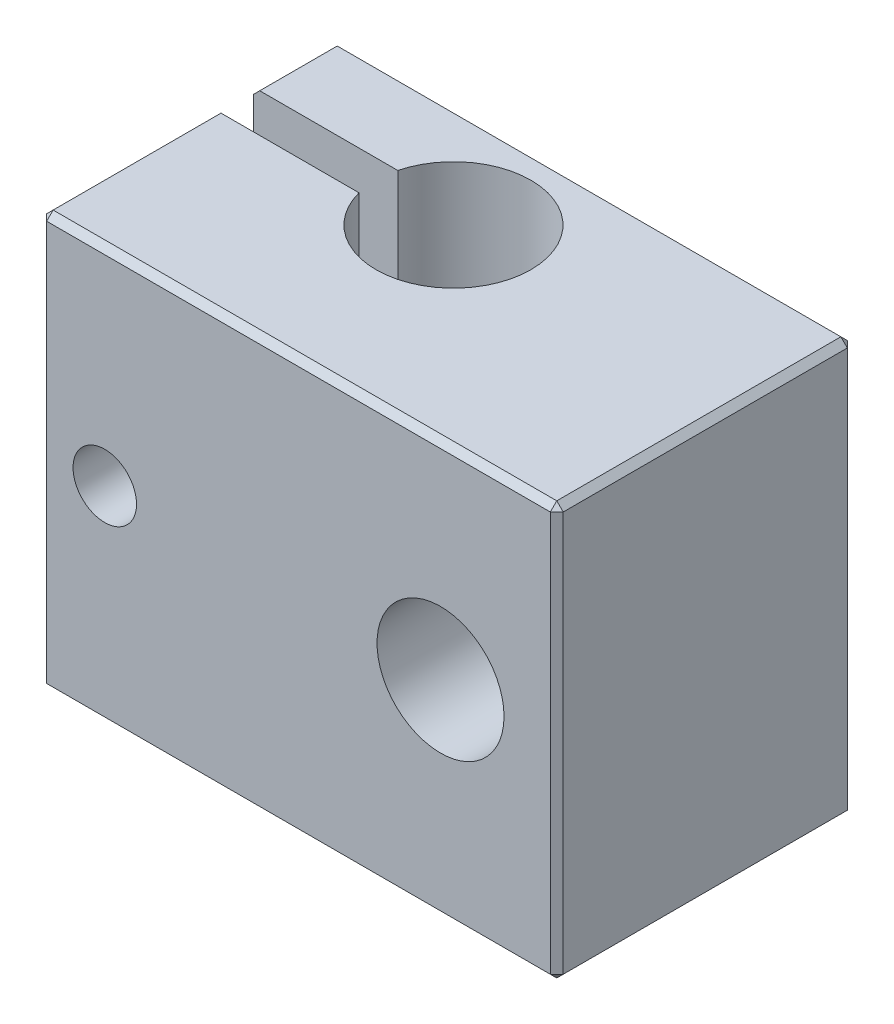
ISO-10303-21;
HEADER;
FILE_DESCRIPTION(('STEP AP214'),'2;1');
FILE_NAME('part.step','',(''),(''),'','','');
FILE_SCHEMA(('AUTOMOTIVE_DESIGN { 1 0 10303 214 1 1 1 1 }'));
ENDSEC;
DATA;
#1=APPLICATION_CONTEXT('core data for automotive mechanical design processes');
#2=APPLICATION_PROTOCOL_DEFINITION('international standard','automotive_design',2000,#1);
#3=PRODUCT_CONTEXT('',#1,'mechanical');
#4=PRODUCT('Part','Part','',(#3));
#5=PRODUCT_RELATED_PRODUCT_CATEGORY('part','',(#4));
#6=PRODUCT_DEFINITION_FORMATION('','',#4);
#7=PRODUCT_DEFINITION_CONTEXT('part definition',#1,'design');
#8=PRODUCT_DEFINITION('design','',#6,#7);
#9=PRODUCT_DEFINITION_SHAPE('','',#8);
#10=(LENGTH_UNIT() NAMED_UNIT(*) SI_UNIT(.MILLI.,.METRE.));
#11=(NAMED_UNIT(*) PLANE_ANGLE_UNIT() SI_UNIT($,.RADIAN.));
#12=(NAMED_UNIT(*) SI_UNIT($,.STERADIAN.) SOLID_ANGLE_UNIT());
#13=UNCERTAINTY_MEASURE_WITH_UNIT(LENGTH_MEASURE(1.E-05),#10,'distance_accuracy_value','');
#14=(GEOMETRIC_REPRESENTATION_CONTEXT(3) GLOBAL_UNCERTAINTY_ASSIGNED_CONTEXT((#13)) GLOBAL_UNIT_ASSIGNED_CONTEXT((#10,
#11,#12)) REPRESENTATION_CONTEXT('',''));
#15=CARTESIAN_POINT('',(0.,0.,0.));
#16=DIRECTION('',(0.,0.,1.));
#17=DIRECTION('',(1.,0.,0.));
#18=AXIS2_PLACEMENT_3D('',#15,#16,#17);
#19=CARTESIAN_POINT('',(0.25,0.,0.25));
#20=DIRECTION('',(-0.577350269189626,-0.577350269189626,-0.577350269189625));
#21=DIRECTION('',(-0.816496580927726,0.408248290463863,0.408248290463863));
#22=AXIS2_PLACEMENT_3D('',#19,#20,#21);
#23=PLANE('',#22);
#24=DIRECTION('',(-0.707106781186547,0.,0.707106781186548));
#25=VECTOR('',#24,1.);
#26=CARTESIAN_POINT('',(0.25,0.25,0.));
#27=LINE('',#26,#25);
#28=CARTESIAN_POINT('',(0.25,0.25,0.));
#29=VERTEX_POINT('',#28);
#30=CARTESIAN_POINT('',(0.,0.25,0.25));
#31=VERTEX_POINT('',#30);
#32=EDGE_CURVE('E36',#29,#31,#27,.T.);
#33=ORIENTED_EDGE('',*,*,#32,.F.);
#34=DIRECTION('',(0.,0.707106781186548,-0.707106781186547));
#35=VECTOR('',#34,1.);
#36=CARTESIAN_POINT('',(0.25,0.,0.25));
#37=LINE('',#36,#35);
#38=CARTESIAN_POINT('',(0.25,0.,0.25));
#39=VERTEX_POINT('',#38);
#40=EDGE_CURVE('E378',#39,#29,#37,.T.);
#41=ORIENTED_EDGE('',*,*,#40,.F.);
#42=DIRECTION('',(0.707106781186548,-0.707106781186548,0.));
#43=VECTOR('',#42,1.);
#44=CARTESIAN_POINT('',(0.,0.25,0.25));
#45=LINE('',#44,#43);
#46=EDGE_CURVE('E249',#31,#39,#45,.T.);
#47=ORIENTED_EDGE('',*,*,#46,.F.);
#48=EDGE_LOOP('',(#33,#41,#47));
#49=FACE_BOUND('',#48,.T.);
#50=ADVANCED_FACE('F17',(#49),#23,.T.);
#51=CARTESIAN_POINT('',(0.249999999999993,15.75,0.));
#52=DIRECTION('',(-0.577350269189624,0.57735026918963,-0.577350269189623));
#53=DIRECTION('',(0.,0.707106781186548,0.707106781186548));
#54=AXIS2_PLACEMENT_3D('',#51,#52,#53);
#55=PLANE('',#54);
#56=DIRECTION('',(-0.707106781186548,-0.707106781186547,0.));
#57=VECTOR('',#56,1.);
#58=CARTESIAN_POINT('',(0.249999999999995,16.,0.25));
#59=LINE('',#58,#57);
#60=CARTESIAN_POINT('',(0.249999999999995,16.,0.25));
#61=VERTEX_POINT('',#60);
#62=CARTESIAN_POINT('',(0.,15.75,0.25));
#63=VERTEX_POINT('',#62);
#64=EDGE_CURVE('E258',#61,#63,#59,.T.);
#65=ORIENTED_EDGE('',*,*,#64,.F.);
#66=DIRECTION('',(0.,0.707106781186546,0.707106781186549));
#67=VECTOR('',#66,1.);
#68=CARTESIAN_POINT('',(0.249999999999993,15.75,0.));
#69=LINE('',#68,#67);
#70=CARTESIAN_POINT('',(0.249999999999995,15.75,0.));
#71=VERTEX_POINT('',#70);
#72=EDGE_CURVE('E362',#71,#61,#69,.T.);
#73=ORIENTED_EDGE('',*,*,#72,.F.);
#74=DIRECTION('',(0.707106781186547,0.,-0.707106781186548));
#75=VECTOR('',#74,1.);
#76=CARTESIAN_POINT('',(0.,15.75,0.25));
#77=LINE('',#76,#75);
#78=EDGE_CURVE('E268',#63,#71,#77,.T.);
#79=ORIENTED_EDGE('',*,*,#78,.F.);
#80=EDGE_LOOP('',(#65,#73,#79));
#81=FACE_BOUND('',#80,.T.);
#82=ADVANCED_FACE('F421',(#81),#55,.T.);
#83=CARTESIAN_POINT('',(19.75,0.25,0.));
#84=DIRECTION('',(0.577350269189627,-0.577350269189625,-0.577350269189625));
#85=DIRECTION('',(0.816496580927725,0.408248290463864,0.408248290463864));
#86=AXIS2_PLACEMENT_3D('',#83,#84,#85);
#87=PLANE('',#86);
#88=DIRECTION('',(0.707106781186546,0.707106781186549,0.));
#89=VECTOR('',#88,1.);
#90=CARTESIAN_POINT('',(19.75,0.,0.25));
#91=LINE('',#90,#89);
#92=CARTESIAN_POINT('',(19.75,0.,0.25));
#93=VERTEX_POINT('',#92);
#94=CARTESIAN_POINT('',(20.,0.25,0.25));
#95=VERTEX_POINT('',#94);
#96=EDGE_CURVE('E345',#93,#95,#91,.T.);
#97=ORIENTED_EDGE('',*,*,#96,.F.);
#98=DIRECTION('',(0.,-0.707106781186548,0.707106781186547));
#99=VECTOR('',#98,1.);
#100=CARTESIAN_POINT('',(19.75,0.25,0.));
#101=LINE('',#100,#99);
#102=CARTESIAN_POINT('',(19.75,0.25,0.));
#103=VERTEX_POINT('',#102);
#104=EDGE_CURVE('E11',#103,#93,#101,.T.);
#105=ORIENTED_EDGE('',*,*,#104,.F.);
#106=DIRECTION('',(-0.707106781186546,0.,-0.707106781186549));
#107=VECTOR('',#106,1.);
#108=CARTESIAN_POINT('',(20.,0.25,0.25));
#109=LINE('',#108,#107);
#110=EDGE_CURVE('E366',#95,#103,#109,.T.);
#111=ORIENTED_EDGE('',*,*,#110,.F.);
#112=EDGE_LOOP('',(#97,#105,#111));
#113=FACE_BOUND('',#112,.T.);
#114=ADVANCED_FACE('F436',(#113),#87,.T.);
#115=CARTESIAN_POINT('',(5.,0.125,0.125));
#116=DIRECTION('',(0.,-0.707106781186547,-0.707106781186548));
#117=DIRECTION('',(0.577350269189626,-0.577350269189626,0.577350269189626));
#118=AXIS2_PLACEMENT_3D('',#115,#116,#117);
#119=PLANE('',#118);
#120=ORIENTED_EDGE('',*,*,#104,.T.);
#121=DIRECTION('',(-1.,0.,0.));
#122=VECTOR('',#121,1.);
#123=CARTESIAN_POINT('',(5.,0.,0.25));
#124=LINE('',#123,#122);
#125=EDGE_CURVE('E27',#93,#39,#124,.T.);
#126=ORIENTED_EDGE('',*,*,#125,.T.);
#127=ORIENTED_EDGE('',*,*,#40,.T.);
#128=DIRECTION('',(1.,0.,0.));
#129=VECTOR('',#128,1.);
#130=CARTESIAN_POINT('',(5.,0.25,0.));
#131=LINE('',#130,#129);
#132=EDGE_CURVE('E374',#29,#103,#131,.T.);
#133=ORIENTED_EDGE('',*,*,#132,.T.);
#134=EDGE_LOOP('',(#120,#126,#127,#133));
#135=FACE_BOUND('',#134,.T.);
#136=ADVANCED_FACE('F427',(#135),#119,.T.);
#137=CARTESIAN_POINT('',(19.75,15.75,0.));
#138=DIRECTION('',(0.577350269189627,0.577350269189627,-0.577350269189624));
#139=DIRECTION('',(0.,0.707106781186548,0.707106781186548));
#140=AXIS2_PLACEMENT_3D('',#137,#138,#139);
#141=PLANE('',#140);
#142=DIRECTION('',(-0.707106781186548,0.707106781186548,0.));
#143=VECTOR('',#142,1.);
#144=CARTESIAN_POINT('',(20.,15.75,0.25));
#145=LINE('',#144,#143);
#146=CARTESIAN_POINT('',(20.,15.75,0.25));
#147=VERTEX_POINT('',#146);
#148=CARTESIAN_POINT('',(19.75,16.,0.25));
#149=VERTEX_POINT('',#148);
#150=EDGE_CURVE('E333',#147,#149,#145,.T.);
#151=ORIENTED_EDGE('',*,*,#150,.F.);
#152=DIRECTION('',(0.707106781186546,0.,0.707106781186549));
#153=VECTOR('',#152,1.);
#154=CARTESIAN_POINT('',(19.75,15.75,0.));
#155=LINE('',#154,#153);
#156=CARTESIAN_POINT('',(19.75,15.75,0.));
#157=VERTEX_POINT('',#156);
#158=EDGE_CURVE('E370',#157,#147,#155,.T.);
#159=ORIENTED_EDGE('',*,*,#158,.F.);
#160=DIRECTION('',(0.,-0.707106781186546,-0.707106781186549));
#161=VECTOR('',#160,1.);
#162=CARTESIAN_POINT('',(19.75,16.,0.25));
#163=LINE('',#162,#161);
#164=EDGE_CURVE('E358',#149,#157,#163,.T.);
#165=ORIENTED_EDGE('',*,*,#164,.F.);
#166=EDGE_LOOP('',(#151,#159,#165));
#167=FACE_BOUND('',#166,.T.);
#168=ADVANCED_FACE('F444',(#167),#141,.T.);
#169=CARTESIAN_POINT('',(19.875,4.,0.125));
#170=DIRECTION('',(0.707106781186549,0.,-0.707106781186546));
#171=DIRECTION('',(0.577350269189624,0.577350269189627,0.577350269189627));
#172=AXIS2_PLACEMENT_3D('',#169,#170,#171);
#173=PLANE('',#172);
#174=ORIENTED_EDGE('',*,*,#158,.T.);
#175=DIRECTION('',(0.,-1.,0.));
#176=VECTOR('',#175,1.);
#177=CARTESIAN_POINT('',(20.,4.,0.25));
#178=LINE('',#177,#176);
#179=EDGE_CURVE('E367',#147,#95,#178,.T.);
#180=ORIENTED_EDGE('',*,*,#179,.T.);
#181=ORIENTED_EDGE('',*,*,#110,.T.);
#182=DIRECTION('',(0.,1.,0.));
#183=VECTOR('',#182,1.);
#184=CARTESIAN_POINT('',(19.75,4.,0.));
#185=LINE('',#184,#183);
#186=EDGE_CURVE('E363',#103,#157,#185,.T.);
#187=ORIENTED_EDGE('',*,*,#186,.T.);
#188=EDGE_LOOP('',(#174,#180,#181,#187));
#189=FACE_BOUND('',#188,.T.);
#190=ADVANCED_FACE('F447',(#189),#173,.T.);
#191=CARTESIAN_POINT('',(15.,15.875,0.125));
#192=DIRECTION('',(0.,0.707106781186549,-0.707106781186546));
#193=DIRECTION('',(0.577350269189627,0.577350269189624,0.577350269189627));
#194=AXIS2_PLACEMENT_3D('',#191,#192,#193);
#195=PLANE('',#194);
#196=ORIENTED_EDGE('',*,*,#72,.T.);
#197=DIRECTION('',(1.,0.,0.));
#198=VECTOR('',#197,1.);
#199=CARTESIAN_POINT('',(15.,16.,0.25));
#200=LINE('',#199,#198);
#201=EDGE_CURVE('E359',#61,#149,#200,.T.);
#202=ORIENTED_EDGE('',*,*,#201,.T.);
#203=ORIENTED_EDGE('',*,*,#164,.T.);
#204=DIRECTION('',(-1.,0.,0.));
#205=VECTOR('',#204,1.);
#206=CARTESIAN_POINT('',(15.,15.75,0.));
#207=LINE('',#206,#205);
#208=EDGE_CURVE('E353',#157,#71,#207,.T.);
#209=ORIENTED_EDGE('',*,*,#208,.T.);
#210=EDGE_LOOP('',(#196,#202,#203,#209));
#211=FACE_BOUND('',#210,.T.);
#212=ADVANCED_FACE('F418',(#211),#195,.T.);
#213=CARTESIAN_POINT('',(20.,0.25,11.25));
#214=DIRECTION('',(0.577350269189627,-0.577350269189624,0.577350269189627));
#215=DIRECTION('',(0.,0.707106781186548,0.707106781186548));
#216=AXIS2_PLACEMENT_3D('',#213,#214,#215);
#217=PLANE('',#216);
#218=DIRECTION('',(0.,0.707106781186549,0.707106781186546));
#219=VECTOR('',#218,1.);
#220=CARTESIAN_POINT('',(19.75,0.,11.25));
#221=LINE('',#220,#219);
#222=CARTESIAN_POINT('',(19.75,0.,11.25));
#223=VERTEX_POINT('',#222);
#224=CARTESIAN_POINT('',(19.75,0.25,11.5));
#225=VERTEX_POINT('',#224);
#226=EDGE_CURVE('E316',#223,#225,#221,.T.);
#227=ORIENTED_EDGE('',*,*,#226,.F.);
#228=DIRECTION('',(-0.707106781186546,-0.707106781186549,0.));
#229=VECTOR('',#228,1.);
#230=CARTESIAN_POINT('',(20.,0.25,11.25));
#231=LINE('',#230,#229);
#232=CARTESIAN_POINT('',(20.,0.25,11.25));
#233=VERTEX_POINT('',#232);
#234=EDGE_CURVE('E349',#233,#223,#231,.T.);
#235=ORIENTED_EDGE('',*,*,#234,.F.);
#236=DIRECTION('',(0.707106781186548,0.,-0.707106781186548));
#237=VECTOR('',#236,1.);
#238=CARTESIAN_POINT('',(19.75,0.25,11.5));
#239=LINE('',#238,#237);
#240=EDGE_CURVE('E275',#225,#233,#239,.T.);
#241=ORIENTED_EDGE('',*,*,#240,.F.);
#242=EDGE_LOOP('',(#227,#235,#241));
#243=FACE_BOUND('',#242,.T.);
#244=ADVANCED_FACE('F454',(#243),#217,.T.);
#245=CARTESIAN_POINT('',(19.875,0.125,0.));
#246=DIRECTION('',(0.707106781186549,-0.707106781186546,0.));
#247=DIRECTION('',(0.577350269189624,0.577350269189627,0.577350269189627));
#248=AXIS2_PLACEMENT_3D('',#245,#246,#247);
#249=PLANE('',#248);
#250=ORIENTED_EDGE('',*,*,#234,.T.);
#251=DIRECTION('',(0.,0.,-1.));
#252=VECTOR('',#251,1.);
#253=CARTESIAN_POINT('',(19.75,0.,0.));
#254=LINE('',#253,#252);
#255=EDGE_CURVE('E346',#223,#93,#254,.T.);
#256=ORIENTED_EDGE('',*,*,#255,.T.);
#257=ORIENTED_EDGE('',*,*,#96,.T.);
#258=DIRECTION('',(0.,0.,1.));
#259=VECTOR('',#258,1.);
#260=CARTESIAN_POINT('',(20.,0.25,0.));
#261=LINE('',#260,#259);
#262=EDGE_CURVE('E341',#95,#233,#261,.T.);
#263=ORIENTED_EDGE('',*,*,#262,.T.);
#264=EDGE_LOOP('',(#250,#256,#257,#263));
#265=FACE_BOUND('',#264,.T.);
#266=ADVANCED_FACE('F457',(#265),#249,.T.);
#267=CARTESIAN_POINT('',(19.75,16.,11.25));
#268=DIRECTION('',(0.577350269189626,0.577350269189626,0.577350269189626));
#269=DIRECTION('',(-0.816496580927726,0.408248290463863,0.408248290463863));
#270=AXIS2_PLACEMENT_3D('',#267,#268,#269);
#271=PLANE('',#270);
#272=DIRECTION('',(-0.707106781186548,0.,0.707106781186548));
#273=VECTOR('',#272,1.);
#274=CARTESIAN_POINT('',(20.,15.75,11.25));
#275=LINE('',#274,#273);
#276=CARTESIAN_POINT('',(20.,15.75,11.25));
#277=VERTEX_POINT('',#276);
#278=CARTESIAN_POINT('',(19.75,15.75,11.5));
#279=VERTEX_POINT('',#278);
#280=EDGE_CURVE('E279',#277,#279,#275,.T.);
#281=ORIENTED_EDGE('',*,*,#280,.F.);
#282=DIRECTION('',(0.707106781186548,-0.707106781186548,0.));
#283=VECTOR('',#282,1.);
#284=CARTESIAN_POINT('',(19.75,16.,11.25));
#285=LINE('',#284,#283);
#286=CARTESIAN_POINT('',(19.75,16.,11.25));
#287=VERTEX_POINT('',#286);
#288=EDGE_CURVE('E337',#287,#277,#285,.T.);
#289=ORIENTED_EDGE('',*,*,#288,.F.);
#290=DIRECTION('',(0.,0.707106781186548,-0.707106781186548));
#291=VECTOR('',#290,1.);
#292=CARTESIAN_POINT('',(19.75,15.75,11.5));
#293=LINE('',#292,#291);
#294=EDGE_CURVE('E283',#279,#287,#293,.T.);
#295=ORIENTED_EDGE('',*,*,#294,.F.);
#296=EDGE_LOOP('',(#281,#289,#295));
#297=FACE_BOUND('',#296,.T.);
#298=ADVANCED_FACE('F461',(#297),#271,.T.);
#299=CARTESIAN_POINT('',(19.875,15.875,0.));
#300=DIRECTION('',(0.707106781186548,0.707106781186548,0.));
#301=DIRECTION('',(-0.577350269189626,0.577350269189626,0.577350269189626));
#302=AXIS2_PLACEMENT_3D('',#299,#300,#301);
#303=PLANE('',#302);
#304=ORIENTED_EDGE('',*,*,#288,.T.);
#305=DIRECTION('',(0.,0.,-1.));
#306=VECTOR('',#305,1.);
#307=CARTESIAN_POINT('',(20.,15.75,0.));
#308=LINE('',#307,#306);
#309=EDGE_CURVE('E334',#277,#147,#308,.T.);
#310=ORIENTED_EDGE('',*,*,#309,.T.);
#311=ORIENTED_EDGE('',*,*,#150,.T.);
#312=DIRECTION('',(0.,0.,1.));
#313=VECTOR('',#312,1.);
#314=CARTESIAN_POINT('',(19.75,16.,0.));
#315=LINE('',#314,#313);
#316=EDGE_CURVE('E326',#149,#287,#315,.T.);
#317=ORIENTED_EDGE('',*,*,#316,.T.);
#318=EDGE_LOOP('',(#304,#310,#311,#317));
#319=FACE_BOUND('',#318,.T.);
#320=ADVANCED_FACE('F465',(#319),#303,.T.);
#321=CARTESIAN_POINT('',(0.25,0.,11.25));
#322=DIRECTION('',(-0.577350269189625,-0.577350269189625,0.577350269189628));
#323=DIRECTION('',(0.,0.707106781186548,0.707106781186548));
#324=AXIS2_PLACEMENT_3D('',#321,#322,#323);
#325=PLANE('',#324);
#326=DIRECTION('',(0.707106781186549,0.,0.707106781186546));
#327=VECTOR('',#326,1.);
#328=CARTESIAN_POINT('',(0.,0.25,11.25));
#329=LINE('',#328,#327);
#330=CARTESIAN_POINT('',(0.,0.25,11.25));
#331=VERTEX_POINT('',#330);
#332=CARTESIAN_POINT('',(0.25,0.25,11.5));
#333=VERTEX_POINT('',#332);
#334=EDGE_CURVE('E295',#331,#333,#329,.T.);
#335=ORIENTED_EDGE('',*,*,#334,.F.);
#336=DIRECTION('',(-0.707106781186548,0.707106781186548,0.));
#337=VECTOR('',#336,1.);
#338=CARTESIAN_POINT('',(0.25,0.,11.25));
#339=LINE('',#338,#337);
#340=CARTESIAN_POINT('',(0.25,0.,11.25));
#341=VERTEX_POINT('',#340);
#342=EDGE_CURVE('E319',#341,#331,#339,.T.);
#343=ORIENTED_EDGE('',*,*,#342,.F.);
#344=DIRECTION('',(0.,-0.707106781186549,-0.707106781186546));
#345=VECTOR('',#344,1.);
#346=CARTESIAN_POINT('',(0.25,0.25,11.5));
#347=LINE('',#346,#345);
#348=EDGE_CURVE('E312',#333,#341,#347,.T.);
#349=ORIENTED_EDGE('',*,*,#348,.F.);
#350=EDGE_LOOP('',(#335,#343,#349));
#351=FACE_BOUND('',#350,.T.);
#352=ADVANCED_FACE('F469',(#351),#325,.T.);
#353=CARTESIAN_POINT('',(0.125,0.125,0.));
#354=DIRECTION('',(-0.707106781186548,-0.707106781186548,0.));
#355=DIRECTION('',(-0.577350269189626,0.577350269189626,0.577350269189626));
#356=AXIS2_PLACEMENT_3D('',#353,#354,#355);
#357=PLANE('',#356);
#358=DIRECTION('',(0.707106781186548,-0.707106781186548,0.));
#359=VECTOR('',#358,1.);
#360=CARTESIAN_POINT('',(0.124999999999999,0.125000000000001,4.75));
#361=LINE('',#360,#359);
#362=CARTESIAN_POINT('',(0.,0.25,4.75));
#363=VERTEX_POINT('',#362);
#364=CARTESIAN_POINT('',(0.25,0.,4.75));
#365=VERTEX_POINT('',#364);
#366=EDGE_CURVE('E323',#363,#365,#361,.T.);
#367=ORIENTED_EDGE('',*,*,#366,.T.);
#368=DIRECTION('',(0.,0.,1.));
#369=VECTOR('',#368,1.);
#370=CARTESIAN_POINT('',(0.25,0.,0.));
#371=LINE('',#370,#369);
#372=EDGE_CURVE('E320',#365,#341,#371,.T.);
#373=ORIENTED_EDGE('',*,*,#372,.T.);
#374=ORIENTED_EDGE('',*,*,#342,.T.);
#375=DIRECTION('',(0.,0.,-1.));
#376=VECTOR('',#375,1.);
#377=CARTESIAN_POINT('',(0.,0.25,0.));
#378=LINE('',#377,#376);
#379=EDGE_CURVE('E317',#331,#363,#378,.T.);
#380=ORIENTED_EDGE('',*,*,#379,.T.);
#381=EDGE_LOOP('',(#367,#373,#374,#380));
#382=FACE_BOUND('',#381,.T.);
#383=ADVANCED_FACE('F473',(#382),#357,.T.);
#384=CARTESIAN_POINT('',(5.,0.125,11.375));
#385=DIRECTION('',(0.,-0.707106781186546,0.707106781186549));
#386=DIRECTION('',(0.577350269189625,0.577350269189628,0.577350269189625));
#387=AXIS2_PLACEMENT_3D('',#384,#385,#386);
#388=PLANE('',#387);
#389=ORIENTED_EDGE('',*,*,#226,.T.);
#390=DIRECTION('',(-1.,0.,0.));
#391=VECTOR('',#390,1.);
#392=CARTESIAN_POINT('',(5.,0.25,11.5));
#393=LINE('',#392,#391);
#394=EDGE_CURVE('E313',#225,#333,#393,.T.);
#395=ORIENTED_EDGE('',*,*,#394,.T.);
#396=ORIENTED_EDGE('',*,*,#348,.T.);
#397=DIRECTION('',(1.,0.,0.));
#398=VECTOR('',#397,1.);
#399=CARTESIAN_POINT('',(5.,0.,11.25));
#400=LINE('',#399,#398);
#401=EDGE_CURVE('E305',#341,#223,#400,.T.);
#402=ORIENTED_EDGE('',*,*,#401,.T.);
#403=EDGE_LOOP('',(#389,#395,#396,#402));
#404=FACE_BOUND('',#403,.T.);
#405=ADVANCED_FACE('F477',(#404),#388,.T.);
#406=CARTESIAN_POINT('',(0.,15.75,11.25));
#407=DIRECTION('',(-0.577350269189625,0.577350269189626,0.577350269189627));
#408=DIRECTION('',(0.816496580927727,0.408248290463862,0.408248290463862));
#409=AXIS2_PLACEMENT_3D('',#406,#407,#408);
#410=PLANE('',#409);
#411=DIRECTION('',(0.,-0.707106781186548,0.707106781186548));
#412=VECTOR('',#411,1.);
#413=CARTESIAN_POINT('',(0.249999999999995,16.,11.25));
#414=LINE('',#413,#412);
#415=CARTESIAN_POINT('',(0.249999999999995,16.,11.25));
#416=VERTEX_POINT('',#415);
#417=CARTESIAN_POINT('',(0.249999999999995,15.75,11.5));
#418=VERTEX_POINT('',#417);
#419=EDGE_CURVE('E287',#416,#418,#414,.T.);
#420=ORIENTED_EDGE('',*,*,#419,.F.);
#421=DIRECTION('',(0.707106781186548,0.707106781186547,0.));
#422=VECTOR('',#421,1.);
#423=CARTESIAN_POINT('',(0.,15.75,11.25));
#424=LINE('',#423,#422);
#425=CARTESIAN_POINT('',(0.,15.75,11.25));
#426=VERTEX_POINT('',#425);
#427=EDGE_CURVE('E298',#426,#416,#424,.T.);
#428=ORIENTED_EDGE('',*,*,#427,.F.);
#429=DIRECTION('',(-0.707106781186549,0.,-0.707106781186546));
#430=VECTOR('',#429,1.);
#431=CARTESIAN_POINT('',(0.249999999999995,15.75,11.5));
#432=LINE('',#431,#430);
#433=EDGE_CURVE('E291',#418,#426,#432,.T.);
#434=ORIENTED_EDGE('',*,*,#433,.F.);
#435=EDGE_LOOP('',(#420,#428,#434));
#436=FACE_BOUND('',#435,.T.);
#437=ADVANCED_FACE('F481',(#436),#410,.T.);
#438=CARTESIAN_POINT('',(0.124999999999995,15.875,0.));
#439=DIRECTION('',(-0.707106781186547,0.707106781186548,0.));
#440=DIRECTION('',(0.577350269189627,0.577350269189625,0.577350269189625));
#441=AXIS2_PLACEMENT_3D('',#438,#439,#440);
#442=PLANE('',#441);
#443=DIRECTION('',(-0.707106781186548,-0.707106781186547,0.));
#444=VECTOR('',#443,1.);
#445=CARTESIAN_POINT('',(-3.875,11.875,4.75));
#446=LINE('',#445,#444);
#447=CARTESIAN_POINT('',(0.249999999999995,16.,4.75));
#448=VERTEX_POINT('',#447);
#449=CARTESIAN_POINT('',(0.,15.75,4.75));
#450=VERTEX_POINT('',#449);
#451=EDGE_CURVE('E302',#448,#450,#446,.T.);
#452=ORIENTED_EDGE('',*,*,#451,.T.);
#453=DIRECTION('',(0.,0.,1.));
#454=VECTOR('',#453,1.);
#455=CARTESIAN_POINT('',(0.,15.75,0.));
#456=LINE('',#455,#454);
#457=EDGE_CURVE('E299',#450,#426,#456,.T.);
#458=ORIENTED_EDGE('',*,*,#457,.T.);
#459=ORIENTED_EDGE('',*,*,#427,.T.);
#460=DIRECTION('',(0.,0.,-1.));
#461=VECTOR('',#460,1.);
#462=CARTESIAN_POINT('',(0.249999999999995,16.,0.));
#463=LINE('',#462,#461);
#464=EDGE_CURVE('E296',#416,#448,#463,.T.);
#465=ORIENTED_EDGE('',*,*,#464,.T.);
#466=EDGE_LOOP('',(#452,#458,#459,#465));
#467=FACE_BOUND('',#466,.T.);
#468=ADVANCED_FACE('F485',(#467),#442,.T.);
#469=CARTESIAN_POINT('',(0.124999999999996,12.,11.375));
#470=DIRECTION('',(-0.707106781186546,0.,0.707106781186549));
#471=DIRECTION('',(0.577350269189627,0.577350269189625,0.577350269189625));
#472=AXIS2_PLACEMENT_3D('',#469,#470,#471);
#473=PLANE('',#472);
#474=ORIENTED_EDGE('',*,*,#334,.T.);
#475=DIRECTION('',(0.,1.,0.));
#476=VECTOR('',#475,1.);
#477=CARTESIAN_POINT('',(0.249999999999997,12.,11.5));
#478=LINE('',#477,#476);
#479=EDGE_CURVE('E292',#333,#418,#478,.T.);
#480=ORIENTED_EDGE('',*,*,#479,.T.);
#481=ORIENTED_EDGE('',*,*,#433,.T.);
#482=DIRECTION('',(0.,-1.,0.));
#483=VECTOR('',#482,1.);
#484=CARTESIAN_POINT('',(0.,12.,11.25));
#485=LINE('',#484,#483);
#486=EDGE_CURVE('E288',#426,#331,#485,.T.);
#487=ORIENTED_EDGE('',*,*,#486,.T.);
#488=EDGE_LOOP('',(#474,#480,#481,#487));
#489=FACE_BOUND('',#488,.T.);
#490=ADVANCED_FACE('F489',(#489),#473,.T.);
#491=CARTESIAN_POINT('',(15.,15.875,11.375));
#492=DIRECTION('',(0.,0.707106781186548,0.707106781186548));
#493=DIRECTION('',(0.577350269189626,-0.577350269189626,0.577350269189626));
#494=AXIS2_PLACEMENT_3D('',#491,#492,#493);
#495=PLANE('',#494);
#496=ORIENTED_EDGE('',*,*,#419,.T.);
#497=DIRECTION('',(1.,0.,0.));
#498=VECTOR('',#497,1.);
#499=CARTESIAN_POINT('',(15.,15.75,11.5));
#500=LINE('',#499,#498);
#501=EDGE_CURVE('E284',#418,#279,#500,.T.);
#502=ORIENTED_EDGE('',*,*,#501,.T.);
#503=ORIENTED_EDGE('',*,*,#294,.T.);
#504=DIRECTION('',(-1.,0.,0.));
#505=VECTOR('',#504,1.);
#506=CARTESIAN_POINT('',(15.,16.,11.25));
#507=LINE('',#506,#505);
#508=EDGE_CURVE('E280',#287,#416,#507,.T.);
#509=ORIENTED_EDGE('',*,*,#508,.T.);
#510=EDGE_LOOP('',(#496,#502,#503,#509));
#511=FACE_BOUND('',#510,.T.);
#512=ADVANCED_FACE('F493',(#511),#495,.T.);
#513=CARTESIAN_POINT('',(19.875,4.,11.375));
#514=DIRECTION('',(0.707106781186548,0.,0.707106781186548));
#515=DIRECTION('',(-0.577350269189626,0.577350269189626,0.577350269189626));
#516=AXIS2_PLACEMENT_3D('',#513,#514,#515);
#517=PLANE('',#516);
#518=ORIENTED_EDGE('',*,*,#280,.T.);
#519=DIRECTION('',(0.,-1.,0.));
#520=VECTOR('',#519,1.);
#521=CARTESIAN_POINT('',(19.75,4.,11.5));
#522=LINE('',#521,#520);
#523=EDGE_CURVE('E276',#279,#225,#522,.T.);
#524=ORIENTED_EDGE('',*,*,#523,.T.);
#525=ORIENTED_EDGE('',*,*,#240,.T.);
#526=DIRECTION('',(0.,1.,0.));
#527=VECTOR('',#526,1.);
#528=CARTESIAN_POINT('',(20.,4.,11.25));
#529=LINE('',#528,#527);
#530=EDGE_CURVE('E272',#233,#277,#529,.T.);
#531=ORIENTED_EDGE('',*,*,#530,.T.);
#532=EDGE_LOOP('',(#518,#524,#525,#531));
#533=FACE_BOUND('',#532,.T.);
#534=ADVANCED_FACE('F497',(#533),#517,.T.);
#535=CARTESIAN_POINT('',(0.124999999999996,12.,0.125));
#536=DIRECTION('',(-0.707106781186548,0.,-0.707106781186547));
#537=DIRECTION('',(-0.577350269189625,0.577350269189626,0.577350269189626));
#538=AXIS2_PLACEMENT_3D('',#535,#536,#537);
#539=PLANE('',#538);
#540=ORIENTED_EDGE('',*,*,#32,.T.);
#541=DIRECTION('',(0.,1.,0.));
#542=VECTOR('',#541,1.);
#543=CARTESIAN_POINT('',(0.,12.,0.25));
#544=LINE('',#543,#542);
#545=EDGE_CURVE('E269',#31,#63,#544,.T.);
#546=ORIENTED_EDGE('',*,*,#545,.T.);
#547=ORIENTED_EDGE('',*,*,#78,.T.);
#548=DIRECTION('',(0.,-1.,0.));
#549=VECTOR('',#548,1.);
#550=CARTESIAN_POINT('',(0.249999999999996,12.,0.));
#551=LINE('',#550,#549);
#552=EDGE_CURVE('E265',#71,#29,#551,.T.);
#553=ORIENTED_EDGE('',*,*,#552,.T.);
#554=EDGE_LOOP('',(#540,#546,#547,#553));
#555=FACE_BOUND('',#554,.T.);
#556=ADVANCED_FACE('F391',(#555),#539,.T.);
#557=CARTESIAN_POINT('',(0.124999999999995,15.875,0.));
#558=DIRECTION('',(-0.707106781186547,0.707106781186548,0.));
#559=DIRECTION('',(0.577350269189627,0.577350269189625,0.577350269189625));
#560=AXIS2_PLACEMENT_3D('',#557,#558,#559);
#561=PLANE('',#560);
#562=DIRECTION('',(0.707106781186548,0.707106781186547,0.));
#563=VECTOR('',#562,1.);
#564=CARTESIAN_POINT('',(-2.4761843774139,13.2738156225861,3.25));
#565=LINE('',#564,#563);
#566=CARTESIAN_POINT('',(0.,15.75,3.25));
#567=VERTEX_POINT('',#566);
#568=CARTESIAN_POINT('',(0.249999999999995,16.,3.25));
#569=VERTEX_POINT('',#568);
#570=EDGE_CURVE('E262',#567,#569,#565,.T.);
#571=ORIENTED_EDGE('',*,*,#570,.T.);
#572=DIRECTION('',(0.,0.,-1.));
#573=VECTOR('',#572,1.);
#574=CARTESIAN_POINT('',(0.249999999999995,16.,0.));
#575=LINE('',#574,#573);
#576=EDGE_CURVE('E259',#569,#61,#575,.T.);
#577=ORIENTED_EDGE('',*,*,#576,.T.);
#578=ORIENTED_EDGE('',*,*,#64,.T.);
#579=DIRECTION('',(0.,0.,1.));
#580=VECTOR('',#579,1.);
#581=CARTESIAN_POINT('',(0.,15.75,0.));
#582=LINE('',#581,#580);
#583=EDGE_CURVE('E256',#63,#567,#582,.T.);
#584=ORIENTED_EDGE('',*,*,#583,.T.);
#585=EDGE_LOOP('',(#571,#577,#578,#584));
#586=FACE_BOUND('',#585,.T.);
#587=ADVANCED_FACE('F403',(#586),#561,.T.);
#588=CARTESIAN_POINT('',(0.125,0.125,0.));
#589=DIRECTION('',(-0.707106781186548,-0.707106781186548,0.));
#590=DIRECTION('',(-0.577350269189626,0.577350269189626,0.577350269189626));
#591=AXIS2_PLACEMENT_3D('',#588,#589,#590);
#592=PLANE('',#591);
#593=DIRECTION('',(-0.707106781186548,0.707106781186548,0.));
#594=VECTOR('',#593,1.);
#595=CARTESIAN_POINT('',(1.52381562258611,-1.27381562258611,3.25));
#596=LINE('',#595,#594);
#597=CARTESIAN_POINT('',(0.25,0.,3.25));
#598=VERTEX_POINT('',#597);
#599=CARTESIAN_POINT('',(0.,0.25,3.25));
#600=VERTEX_POINT('',#599);
#601=EDGE_CURVE('E253',#598,#600,#596,.T.);
#602=ORIENTED_EDGE('',*,*,#601,.T.);
#603=DIRECTION('',(0.,0.,-1.));
#604=VECTOR('',#603,1.);
#605=CARTESIAN_POINT('',(0.,0.25,0.));
#606=LINE('',#605,#604);
#607=EDGE_CURVE('E250',#600,#31,#606,.T.);
#608=ORIENTED_EDGE('',*,*,#607,.T.);
#609=ORIENTED_EDGE('',*,*,#46,.T.);
#610=DIRECTION('',(0.,0.,1.));
#611=VECTOR('',#610,1.);
#612=CARTESIAN_POINT('',(0.25,0.,0.));
#613=LINE('',#612,#611);
#614=EDGE_CURVE('E247',#39,#598,#613,.T.);
#615=ORIENTED_EDGE('',*,*,#614,.T.);
#616=EDGE_LOOP('',(#602,#608,#609,#615));
#617=FACE_BOUND('',#616,.T.);
#618=ADVANCED_FACE('F396',(#617),#592,.T.);
#619=CARTESIAN_POINT('',(20.,16.,0.));
#620=DIRECTION('',(0.,1.,0.));
#621=DIRECTION('',(0.707106781186548,0.,0.707106781186548));
#622=AXIS2_PLACEMENT_3D('',#619,#620,#621);
#623=PLANE('',#622);
#624=ORIENTED_EDGE('',*,*,#464,.F.);
#625=ORIENTED_EDGE('',*,*,#508,.F.);
#626=ORIENTED_EDGE('',*,*,#316,.F.);
#627=ORIENTED_EDGE('',*,*,#201,.F.);
#628=ORIENTED_EDGE('',*,*,#576,.F.);
#629=DIRECTION('',(1.,0.,0.));
#630=VECTOR('',#629,1.);
#631=CARTESIAN_POINT('',(12.7976312451722,16.,3.25));
#632=LINE('',#631,#630);
#633=CARTESIAN_POINT('',(5.59526249034443,16.,3.25));
#634=VERTEX_POINT('',#633);
#635=EDGE_CURVE('E244',#569,#634,#632,.T.);
#636=ORIENTED_EDGE('',*,*,#635,.T.);
#637=CARTESIAN_POINT('',(8.5,16.,4.));
#638=DIRECTION('',(0.,-1.,0.));
#639=DIRECTION('',(-0.968245836551854,0.,-0.25));
#640=AXIS2_PLACEMENT_3D('',#637,#638,#639);
#641=CIRCLE('',#640,3.);
#642=CARTESIAN_POINT('',(5.59526249034444,16.,4.75));
#643=VERTEX_POINT('',#642);
#644=EDGE_CURVE('E241',#634,#643,#641,.T.);
#645=ORIENTED_EDGE('',*,*,#644,.T.);
#646=DIRECTION('',(-1.,0.,0.));
#647=VECTOR('',#646,1.);
#648=CARTESIAN_POINT('',(10.,16.,4.75));
#649=LINE('',#648,#647);
#650=EDGE_CURVE('E238',#643,#448,#649,.T.);
#651=ORIENTED_EDGE('',*,*,#650,.T.);
#652=EDGE_LOOP('',(#624,#625,#626,#627,#628,#636,#645,#651));
#653=FACE_BOUND('',#652,.T.);
#654=ADVANCED_FACE('F412',(#653),#623,.T.);
#655=CARTESIAN_POINT('',(0.,16.,0.));
#656=DIRECTION('',(-1.,0.,0.));
#657=DIRECTION('',(0.,0.707106781186548,0.707106781186548));
#658=AXIS2_PLACEMENT_3D('',#655,#656,#657);
#659=PLANE('',#658);
#660=ORIENTED_EDGE('',*,*,#583,.F.);
#661=ORIENTED_EDGE('',*,*,#545,.F.);
#662=ORIENTED_EDGE('',*,*,#607,.F.);
#663=DIRECTION('',(0.,1.,0.));
#664=VECTOR('',#663,1.);
#665=CARTESIAN_POINT('',(0.,8.,3.25));
#666=LINE('',#665,#664);
#667=EDGE_CURVE('E233',#600,#567,#666,.T.);
#668=ORIENTED_EDGE('',*,*,#667,.T.);
#669=EDGE_LOOP('',(#660,#661,#662,#668));
#670=FACE_BOUND('',#669,.T.);
#671=ADVANCED_FACE('F400',(#670),#659,.T.);
#672=CARTESIAN_POINT('',(5.59526249034443,0.,3.25));
#673=DIRECTION('',(0.,0.,-1.));
#674=DIRECTION('',(0.707106781186548,0.707106781186548,0.));
#675=AXIS2_PLACEMENT_3D('',#672,#673,#674);
#676=PLANE('',#675);
#677=ORIENTED_EDGE('',*,*,#570,.F.);
#678=ORIENTED_EDGE('',*,*,#667,.F.);
#679=ORIENTED_EDGE('',*,*,#601,.F.);
#680=DIRECTION('',(-1.,0.,0.));
#681=VECTOR('',#680,1.);
#682=CARTESIAN_POINT('',(2.79763124517221,0.,3.25));
#683=LINE('',#682,#681);
#684=CARTESIAN_POINT('',(5.59526249034443,0.,3.25));
#685=VERTEX_POINT('',#684);
#686=EDGE_CURVE('E189',#685,#598,#683,.T.);
#687=ORIENTED_EDGE('',*,*,#686,.F.);
#688=DIRECTION('',(0.,1.,0.));
#689=VECTOR('',#688,1.);
#690=CARTESIAN_POINT('',(5.59526249034443,0.,3.25));
#691=LINE('',#690,#689);
#692=EDGE_CURVE('E230',#685,#634,#691,.T.);
#693=ORIENTED_EDGE('',*,*,#692,.T.);
#694=ORIENTED_EDGE('',*,*,#635,.F.);
#695=EDGE_LOOP('',(#677,#678,#679,#687,#693,#694));
#696=FACE_BOUND('',#695,.T.);
#697=CARTESIAN_POINT('',(2.5,8.,3.25));
#698=DIRECTION('',(0.,0.,-1.));
#699=DIRECTION('',(-1.,0.,0.));
#700=AXIS2_PLACEMENT_3D('',#697,#698,#699);
#701=CIRCLE('',#700,1.5);
#702=CARTESIAN_POINT('',(4.,8.,3.25));
#703=VERTEX_POINT('',#702);
#704=EDGE_CURVE('E227',#703,#703,#701,.T.);
#705=ORIENTED_EDGE('',*,*,#704,.T.);
#706=EDGE_LOOP('',(#705));
#707=FACE_BOUND('',#706,.T.);
#708=ADVANCED_FACE('F407',(#696,#707),#676,.F.);
#709=CARTESIAN_POINT('',(10.,8.,0.));
#710=DIRECTION('',(0.,0.,1.));
#711=DIRECTION('',(0.707106781186548,0.707106781186548,0.));
#712=AXIS2_PLACEMENT_3D('',#709,#710,#711);
#713=PLANE('',#712);
#714=CARTESIAN_POINT('',(15.5,8.,0.));
#715=DIRECTION('',(0.,0.,1.));
#716=DIRECTION('',(1.,0.,0.));
#717=AXIS2_PLACEMENT_3D('',#714,#715,#716);
#718=CIRCLE('',#717,2.4585);
#719=CARTESIAN_POINT('',(13.0415,8.,0.));
#720=VERTEX_POINT('',#719);
#721=EDGE_CURVE('E224',#720,#720,#718,.T.);
#722=ORIENTED_EDGE('',*,*,#721,.T.);
#723=EDGE_LOOP('',(#722));
#724=FACE_BOUND('',#723,.T.);
#725=CARTESIAN_POINT('',(2.5,8.,0.));
#726=DIRECTION('',(0.,0.,1.));
#727=DIRECTION('',(-1.,0.,0.));
#728=AXIS2_PLACEMENT_3D('',#725,#726,#727);
#729=CIRCLE('',#728,1.5);
#730=CARTESIAN_POINT('',(1.,8.,0.));
#731=VERTEX_POINT('',#730);
#732=EDGE_CURVE('E221',#731,#731,#729,.T.);
#733=ORIENTED_EDGE('',*,*,#732,.T.);
#734=EDGE_LOOP('',(#733));
#735=FACE_BOUND('',#734,.T.);
#736=ORIENTED_EDGE('',*,*,#132,.F.);
#737=ORIENTED_EDGE('',*,*,#552,.F.);
#738=ORIENTED_EDGE('',*,*,#208,.F.);
#739=ORIENTED_EDGE('',*,*,#186,.F.);
#740=EDGE_LOOP('',(#736,#737,#738,#739));
#741=FACE_BOUND('',#740,.T.);
#742=ADVANCED_FACE('F423',(#724,#735,#741),#713,.F.);
#743=CARTESIAN_POINT('',(20.,0.,0.));
#744=DIRECTION('',(1.,0.,0.));
#745=DIRECTION('',(0.,0.707106781186548,0.707106781186548));
#746=AXIS2_PLACEMENT_3D('',#743,#744,#745);
#747=PLANE('',#746);
#748=ORIENTED_EDGE('',*,*,#179,.F.);
#749=ORIENTED_EDGE('',*,*,#309,.F.);
#750=ORIENTED_EDGE('',*,*,#530,.F.);
#751=ORIENTED_EDGE('',*,*,#262,.F.);
#752=EDGE_LOOP('',(#748,#749,#750,#751));
#753=FACE_BOUND('',#752,.T.);
#754=ADVANCED_FACE('F516',(#753),#747,.T.);
#755=CARTESIAN_POINT('',(10.,8.,11.5));
#756=DIRECTION('',(0.,0.,1.));
#757=DIRECTION('',(0.707106781186548,0.707106781186548,0.));
#758=AXIS2_PLACEMENT_3D('',#755,#756,#757);
#759=PLANE('',#758);
#760=CARTESIAN_POINT('',(2.5,8.,11.5));
#761=DIRECTION('',(0.,0.,-1.));
#762=DIRECTION('',(1.,0.,0.));
#763=AXIS2_PLACEMENT_3D('',#760,#761,#762);
#764=CIRCLE('',#763,1.2295);
#765=CARTESIAN_POINT('',(3.7295,8.,11.5));
#766=VERTEX_POINT('',#765);
#767=EDGE_CURVE('E218',#766,#766,#764,.T.);
#768=ORIENTED_EDGE('',*,*,#767,.T.);
#769=EDGE_LOOP('',(#768));
#770=FACE_BOUND('',#769,.T.);
#771=CARTESIAN_POINT('',(15.5,8.,11.5));
#772=DIRECTION('',(0.,0.,-1.));
#773=DIRECTION('',(1.,0.,0.));
#774=AXIS2_PLACEMENT_3D('',#771,#772,#773);
#775=CIRCLE('',#774,2.4585);
#776=CARTESIAN_POINT('',(17.9585,8.,11.5));
#777=VERTEX_POINT('',#776);
#778=EDGE_CURVE('E208',#777,#777,#775,.T.);
#779=ORIENTED_EDGE('',*,*,#778,.T.);
#780=EDGE_LOOP('',(#779));
#781=FACE_BOUND('',#780,.T.);
#782=ORIENTED_EDGE('',*,*,#394,.F.);
#783=ORIENTED_EDGE('',*,*,#523,.F.);
#784=ORIENTED_EDGE('',*,*,#501,.F.);
#785=ORIENTED_EDGE('',*,*,#479,.F.);
#786=EDGE_LOOP('',(#782,#783,#784,#785));
#787=FACE_BOUND('',#786,.T.);
#788=ADVANCED_FACE('F520',(#770,#781,#787),#759,.T.);
#789=CARTESIAN_POINT('',(2.5,8.,28.0757902827329));
#790=DIRECTION('',(0.,0.,-1.));
#791=DIRECTION('',(-1.,0.,0.));
#792=AXIS2_PLACEMENT_3D('',#789,#790,#791);
#793=CYLINDRICAL_SURFACE('',#792,1.5);
#794=ORIENTED_EDGE('',*,*,#704,.F.);
#795=EDGE_LOOP('',(#794));
#796=FACE_BOUND('',#795,.T.);
#797=ORIENTED_EDGE('',*,*,#732,.F.);
#798=EDGE_LOOP('',(#797));
#799=FACE_BOUND('',#798,.T.);
#800=ADVANCED_FACE('F524',(#796,#799),#793,.F.);
#801=CARTESIAN_POINT('',(0.,0.,4.75));
#802=DIRECTION('',(0.,0.,1.));
#803=DIRECTION('',(0.707106781186548,0.707106781186548,0.));
#804=AXIS2_PLACEMENT_3D('',#801,#802,#803);
#805=PLANE('',#804);
#806=ORIENTED_EDGE('',*,*,#451,.F.);
#807=ORIENTED_EDGE('',*,*,#650,.F.);
#808=DIRECTION('',(0.,1.,0.));
#809=VECTOR('',#808,1.);
#810=CARTESIAN_POINT('',(5.59526249034444,0.,4.75));
#811=LINE('',#810,#809);
#812=CARTESIAN_POINT('',(5.59526249034444,0.,4.75));
#813=VERTEX_POINT('',#812);
#814=EDGE_CURVE('E196',#813,#643,#811,.T.);
#815=ORIENTED_EDGE('',*,*,#814,.F.);
#816=DIRECTION('',(1.,0.,0.));
#817=VECTOR('',#816,1.);
#818=CARTESIAN_POINT('',(0.,0.,4.75));
#819=LINE('',#818,#817);
#820=EDGE_CURVE('E212',#365,#813,#819,.T.);
#821=ORIENTED_EDGE('',*,*,#820,.F.);
#822=ORIENTED_EDGE('',*,*,#366,.F.);
#823=DIRECTION('',(0.,-1.,0.));
#824=VECTOR('',#823,1.);
#825=CARTESIAN_POINT('',(0.,8.,4.75));
#826=LINE('',#825,#824);
#827=EDGE_CURVE('E209',#450,#363,#826,.T.);
#828=ORIENTED_EDGE('',*,*,#827,.F.);
#829=EDGE_LOOP('',(#806,#807,#815,#821,#822,#828));
#830=FACE_BOUND('',#829,.T.);
#831=CARTESIAN_POINT('',(2.5,8.,4.75));
#832=DIRECTION('',(0.,0.,1.));
#833=DIRECTION('',(1.,0.,0.));
#834=AXIS2_PLACEMENT_3D('',#831,#832,#833);
#835=CIRCLE('',#834,1.2295);
#836=CARTESIAN_POINT('',(1.2705,8.,4.75));
#837=VERTEX_POINT('',#836);
#838=EDGE_CURVE('E203',#837,#837,#835,.T.);
#839=ORIENTED_EDGE('',*,*,#838,.T.);
#840=EDGE_LOOP('',(#839));
#841=FACE_BOUND('',#840,.T.);
#842=ADVANCED_FACE('F528',(#830,#841),#805,.F.);
#843=CARTESIAN_POINT('',(2.5,8.,-16.5757902827329));
#844=DIRECTION('',(0.,0.,1.));
#845=DIRECTION('',(1.,0.,0.));
#846=AXIS2_PLACEMENT_3D('',#843,#844,#845);
#847=CYLINDRICAL_SURFACE('',#846,1.2295);
#848=ORIENTED_EDGE('',*,*,#838,.F.);
#849=EDGE_LOOP('',(#848));
#850=FACE_BOUND('',#849,.T.);
#851=ORIENTED_EDGE('',*,*,#767,.F.);
#852=EDGE_LOOP('',(#851));
#853=FACE_BOUND('',#852,.T.);
#854=ADVANCED_FACE('F532',(#850,#853),#847,.F.);
#855=CARTESIAN_POINT('',(18.,2.30043030951378,2.));
#856=DIRECTION('',(0.,-1.,0.));
#857=DIRECTION('',(1.,0.,0.));
#858=AXIS2_PLACEMENT_3D('',#855,#856,#857);
#859=CONICAL_SURFACE('',#858,0.5,1.02974425867665);
#860=CARTESIAN_POINT('',(18.,2.15021515475689,2.));
#861=DIRECTION('',(0.,-1.,0.));
#862=DIRECTION('',(1.,0.,0.));
#863=AXIS2_PLACEMENT_3D('',#860,#861,#862);
#864=CIRCLE('',#863,0.75);
#865=CARTESIAN_POINT('',(17.25,2.15021515475689,2.));
#866=VERTEX_POINT('',#865);
#867=EDGE_CURVE('E195',#866,#866,#864,.T.);
#868=ORIENTED_EDGE('',*,*,#867,.F.);
#869=EDGE_LOOP('',(#868));
#870=FACE_BOUND('',#869,.T.);
#871=CARTESIAN_POINT('',(18.,2.,2.));
#872=DIRECTION('',(0.,-1.,0.));
#873=DIRECTION('',(1.,0.,0.));
#874=AXIS2_PLACEMENT_3D('',#871,#872,#873);
#875=CIRCLE('',#874,1.);
#876=CARTESIAN_POINT('',(19.,2.,2.));
#877=VERTEX_POINT('',#876);
#878=EDGE_CURVE('E199',#877,#877,#875,.T.);
#879=ORIENTED_EDGE('',*,*,#878,.T.);
#880=EDGE_LOOP('',(#879));
#881=FACE_BOUND('',#880,.T.);
#882=ADVANCED_FACE('F536',(#870,#881),#859,.F.);
#883=CARTESIAN_POINT('',(18.,1.,2.));
#884=DIRECTION('',(0.,-1.,0.));
#885=DIRECTION('',(1.,0.,0.));
#886=AXIS2_PLACEMENT_3D('',#883,#884,#885);
#887=CYLINDRICAL_SURFACE('',#886,1.);
#888=CARTESIAN_POINT('',(18.,0.,2.));
#889=DIRECTION('',(0.,1.,0.));
#890=DIRECTION('',(1.,0.,0.));
#891=AXIS2_PLACEMENT_3D('',#888,#889,#890);
#892=CIRCLE('',#891,1.);
#893=CARTESIAN_POINT('',(19.,0.,2.));
#894=VERTEX_POINT('',#893);
#895=EDGE_CURVE('E187',#894,#894,#892,.T.);
#896=ORIENTED_EDGE('',*,*,#895,.F.);
#897=EDGE_LOOP('',(#896));
#898=FACE_BOUND('',#897,.T.);
#899=ORIENTED_EDGE('',*,*,#878,.F.);
#900=EDGE_LOOP('',(#899));
#901=FACE_BOUND('',#900,.T.);
#902=ADVANCED_FACE('F540',(#898,#901),#887,.F.);
#903=CARTESIAN_POINT('',(18.,4.72532273213534,2.));
#904=DIRECTION('',(0.,-1.,0.));
#905=DIRECTION('',(1.,0.,0.));
#906=AXIS2_PLACEMENT_3D('',#903,#904,#905);
#907=CONICAL_SURFACE('',#906,0.375,1.02974425867665);
#908=CARTESIAN_POINT('',(18.,4.5,2.));
#909=DIRECTION('',(0.,-1.,0.));
#910=DIRECTION('',(1.,0.,0.));
#911=AXIS2_PLACEMENT_3D('',#908,#909,#910);
#912=CIRCLE('',#911,0.75);
#913=CARTESIAN_POINT('',(18.75,4.5,2.));
#914=VERTEX_POINT('',#913);
#915=EDGE_CURVE('E197',#914,#914,#912,.T.);
#916=ORIENTED_EDGE('',*,*,#915,.T.);
#917=EDGE_LOOP('',(#916));
#918=FACE_BOUND('',#917,.T.);
#919=CARTESIAN_POINT('',(18.,4.95064546427067,2.));
#920=VERTEX_POINT('',#919);
#921=VERTEX_LOOP('',#920);
#922=FACE_BOUND('',#921,.T.);
#923=ADVANCED_FACE('F544',(#918,#922),#907,.F.);
#924=CARTESIAN_POINT('',(18.,2.25,2.));
#925=DIRECTION('',(0.,-1.,0.));
#926=DIRECTION('',(1.,0.,0.));
#927=AXIS2_PLACEMENT_3D('',#924,#925,#926);
#928=CYLINDRICAL_SURFACE('',#927,0.75);
#929=ORIENTED_EDGE('',*,*,#867,.T.);
#930=EDGE_LOOP('',(#929));
#931=FACE_BOUND('',#930,.T.);
#932=ORIENTED_EDGE('',*,*,#915,.F.);
#933=EDGE_LOOP('',(#932));
#934=FACE_BOUND('',#933,.T.);
#935=ADVANCED_FACE('F548',(#931,#934),#928,.F.);
#936=CARTESIAN_POINT('',(16.5,3.86937906554719,4.8));
#937=DIRECTION('',(0.,-1.,0.));
#938=DIRECTION('',(1.,0.,0.));
#939=AXIS2_PLACEMENT_3D('',#936,#937,#938);
#940=CONICAL_SURFACE('',#939,0.61475,1.02974425867665);
#941=CARTESIAN_POINT('',(16.5,3.5,4.8));
#942=DIRECTION('',(0.,-1.,0.));
#943=DIRECTION('',(1.,0.,0.));
#944=AXIS2_PLACEMENT_3D('',#941,#942,#943);
#945=CIRCLE('',#944,1.2295);
#946=CARTESIAN_POINT('',(17.7295,3.5,4.8));
#947=VERTEX_POINT('',#946);
#948=EDGE_CURVE('E192',#947,#947,#945,.T.);
#949=ORIENTED_EDGE('',*,*,#948,.T.);
#950=EDGE_LOOP('',(#949));
#951=FACE_BOUND('',#950,.T.);
#952=CARTESIAN_POINT('',(16.5,4.23875813109438,4.8));
#953=VERTEX_POINT('',#952);
#954=VERTEX_LOOP('',#953);
#955=FACE_BOUND('',#954,.T.);
#956=ADVANCED_FACE('F552',(#951,#955),#940,.F.);
#957=CARTESIAN_POINT('',(16.5,1.75,4.8));
#958=DIRECTION('',(0.,-1.,0.));
#959=DIRECTION('',(1.,0.,0.));
#960=AXIS2_PLACEMENT_3D('',#957,#958,#959);
#961=CYLINDRICAL_SURFACE('',#960,1.2295);
#962=CARTESIAN_POINT('',(16.5,0.,4.8));
#963=DIRECTION('',(0.,1.,0.));
#964=DIRECTION('',(1.,0.,0.));
#965=AXIS2_PLACEMENT_3D('',#962,#963,#964);
#966=CIRCLE('',#965,1.2295);
#967=CARTESIAN_POINT('',(17.7295,0.,4.8));
#968=VERTEX_POINT('',#967);
#969=EDGE_CURVE('E183',#968,#968,#966,.T.);
#970=ORIENTED_EDGE('',*,*,#969,.F.);
#971=EDGE_LOOP('',(#970));
#972=FACE_BOUND('',#971,.T.);
#973=ORIENTED_EDGE('',*,*,#948,.F.);
#974=EDGE_LOOP('',(#973));
#975=FACE_BOUND('',#974,.T.);
#976=ADVANCED_FACE('F184',(#972,#975),#961,.F.);
#977=CARTESIAN_POINT('',(8.5,0.,4.));
#978=DIRECTION('',(0.,1.,0.));
#979=DIRECTION('',(-0.968245836551854,0.,-0.25));
#980=AXIS2_PLACEMENT_3D('',#977,#978,#979);
#981=CYLINDRICAL_SURFACE('',#980,3.);
#982=ORIENTED_EDGE('',*,*,#644,.F.);
#983=ORIENTED_EDGE('',*,*,#692,.F.);
#984=CARTESIAN_POINT('',(8.5,0.,4.));
#985=DIRECTION('',(0.,1.,0.));
#986=DIRECTION('',(-0.968245836551854,0.,-0.25));
#987=AXIS2_PLACEMENT_3D('',#984,#985,#986);
#988=CIRCLE('',#987,3.);
#989=EDGE_CURVE('E21',#813,#685,#988,.T.);
#990=ORIENTED_EDGE('',*,*,#989,.F.);
#991=ORIENTED_EDGE('',*,*,#814,.T.);
#992=EDGE_LOOP('',(#982,#983,#990,#991));
#993=FACE_BOUND('',#992,.T.);
#994=ADVANCED_FACE('F559',(#993),#981,.F.);
#995=CARTESIAN_POINT('',(0.,16.,0.));
#996=DIRECTION('',(-1.,0.,0.));
#997=DIRECTION('',(0.,0.707106781186548,0.707106781186548));
#998=AXIS2_PLACEMENT_3D('',#995,#996,#997);
#999=PLANE('',#998);
#1000=ORIENTED_EDGE('',*,*,#457,.F.);
#1001=ORIENTED_EDGE('',*,*,#827,.T.);
#1002=ORIENTED_EDGE('',*,*,#379,.F.);
#1003=ORIENTED_EDGE('',*,*,#486,.F.);
#1004=EDGE_LOOP('',(#1000,#1001,#1002,#1003));
#1005=FACE_BOUND('',#1004,.T.);
#1006=ADVANCED_FACE('F562',(#1005),#999,.T.);
#1007=CARTESIAN_POINT('',(15.5,8.,-16.5757902827329));
#1008=DIRECTION('',(0.,0.,1.));
#1009=DIRECTION('',(1.,0.,0.));
#1010=AXIS2_PLACEMENT_3D('',#1007,#1008,#1009);
#1011=CYLINDRICAL_SURFACE('',#1010,2.4585);
#1012=ORIENTED_EDGE('',*,*,#721,.F.);
#1013=EDGE_LOOP('',(#1012));
#1014=FACE_BOUND('',#1013,.T.);
#1015=ORIENTED_EDGE('',*,*,#778,.F.);
#1016=EDGE_LOOP('',(#1015));
#1017=FACE_BOUND('',#1016,.T.);
#1018=ADVANCED_FACE('F565',(#1014,#1017),#1011,.F.);
#1019=CARTESIAN_POINT('',(0.,0.,0.));
#1020=DIRECTION('',(0.,-1.,0.));
#1021=DIRECTION('',(0.707106781186548,0.,0.707106781186548));
#1022=AXIS2_PLACEMENT_3D('',#1019,#1020,#1021);
#1023=PLANE('',#1022);
#1024=ORIENTED_EDGE('',*,*,#372,.F.);
#1025=ORIENTED_EDGE('',*,*,#820,.T.);
#1026=ORIENTED_EDGE('',*,*,#989,.T.);
#1027=ORIENTED_EDGE('',*,*,#686,.T.);
#1028=ORIENTED_EDGE('',*,*,#614,.F.);
#1029=ORIENTED_EDGE('',*,*,#125,.F.);
#1030=ORIENTED_EDGE('',*,*,#255,.F.);
#1031=ORIENTED_EDGE('',*,*,#401,.F.);
#1032=EDGE_LOOP('',(#1024,#1025,#1026,#1027,#1028,#1029,#1030,#1031));
#1033=FACE_BOUND('',#1032,.T.);
#1034=ORIENTED_EDGE('',*,*,#895,.T.);
#1035=EDGE_LOOP('',(#1034));
#1036=FACE_BOUND('',#1035,.T.);
#1037=ORIENTED_EDGE('',*,*,#969,.T.);
#1038=EDGE_LOOP('',(#1037));
#1039=FACE_BOUND('',#1038,.T.);
#1040=ADVANCED_FACE('F19',(#1033,#1036,#1039),#1023,.T.);
#1041=CLOSED_SHELL('',(#50,#82,#114,#136,#168,#190,#212,#244,#266,#298,#320,#352,#383,#405,#437,
#468,#490,#512,#534,#556,#587,#618,#654,#671,#708,#742,#754,#788,#800,#842,#854,#882,#902,#923,
#935,#956,#976,#994,#1006,#1018,#1040));
#1042=MANIFOLD_SOLID_BREP('B1',#1041);
#1043=ADVANCED_BREP_SHAPE_REPRESENTATION('',(#18,#1042),#14);
#1044=SHAPE_DEFINITION_REPRESENTATION(#9,#1043);
ENDSEC;
END-ISO-10303-21;
